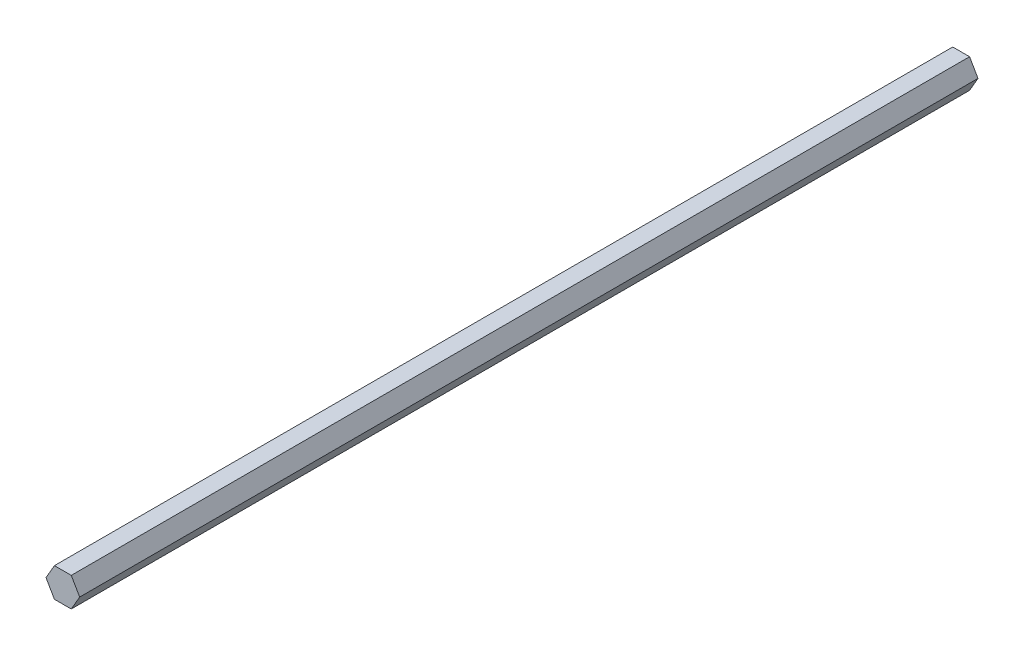
ISO-10303-21;
HEADER;
FILE_DESCRIPTION(('STEP AP214'),'2;1');
FILE_NAME('part.step','',(''),(''),'','','');
FILE_SCHEMA(('AUTOMOTIVE_DESIGN { 1 0 10303 214 1 1 1 1 }'));
ENDSEC;
DATA;
#1=APPLICATION_CONTEXT('core data for automotive mechanical design processes');
#2=APPLICATION_PROTOCOL_DEFINITION('international standard','automotive_design',2000,#1);
#3=PRODUCT_CONTEXT('',#1,'mechanical');
#4=PRODUCT('Part','Part','',(#3));
#5=PRODUCT_RELATED_PRODUCT_CATEGORY('part','',(#4));
#6=PRODUCT_DEFINITION_FORMATION('','',#4);
#7=PRODUCT_DEFINITION_CONTEXT('part definition',#1,'design');
#8=PRODUCT_DEFINITION('design','',#6,#7);
#9=PRODUCT_DEFINITION_SHAPE('','',#8);
#10=(LENGTH_UNIT() NAMED_UNIT(*) SI_UNIT(.MILLI.,.METRE.));
#11=(NAMED_UNIT(*) PLANE_ANGLE_UNIT() SI_UNIT($,.RADIAN.));
#12=(NAMED_UNIT(*) SI_UNIT($,.STERADIAN.) SOLID_ANGLE_UNIT());
#13=UNCERTAINTY_MEASURE_WITH_UNIT(LENGTH_MEASURE(1.E-05),#10,'distance_accuracy_value','');
#14=(GEOMETRIC_REPRESENTATION_CONTEXT(3) GLOBAL_UNCERTAINTY_ASSIGNED_CONTEXT((#13)) GLOBAL_UNIT_ASSIGNED_CONTEXT((#10,
#11,#12)) REPRESENTATION_CONTEXT('',''));
#15=CARTESIAN_POINT('',(0.,0.,0.));
#16=DIRECTION('',(0.,0.,1.));
#17=DIRECTION('',(1.,0.,0.));
#18=AXIS2_PLACEMENT_3D('',#15,#16,#17);
#19=CARTESIAN_POINT('',(3.66617420935418,-6.34999999999993,391.16));
#20=DIRECTION('',(-0.866025403784442,0.499999999999995,0.));
#21=DIRECTION('',(-0.499999999999995,-0.866025403784442,0.));
#22=AXIS2_PLACEMENT_3D('',#19,#20,#21);
#23=PLANE('',#22);
#24=DIRECTION('',(0.499999999999995,0.866025403784441,0.));
#25=VECTOR('',#24,1.);
#26=CARTESIAN_POINT('',(3.66617420935418,-6.34999999999993,0.));
#27=LINE('',#26,#25);
#28=CARTESIAN_POINT('',(3.66617420935418,-6.34999999999993,0.));
#29=VERTEX_POINT('',#28);
#30=CARTESIAN_POINT('',(7.33234841870822,0.,0.));
#31=VERTEX_POINT('',#30);
#32=EDGE_CURVE('E116',#29,#31,#27,.T.);
#33=ORIENTED_EDGE('',*,*,#32,.T.);
#34=DIRECTION('',(0.,0.,-1.));
#35=VECTOR('',#34,1.);
#36=CARTESIAN_POINT('',(7.33234841870822,0.,391.16));
#37=LINE('',#36,#35);
#38=CARTESIAN_POINT('',(7.33234841870822,0.,391.16));
#39=VERTEX_POINT('',#38);
#40=EDGE_CURVE('E11',#39,#31,#37,.T.);
#41=ORIENTED_EDGE('',*,*,#40,.F.);
#42=DIRECTION('',(0.499999999999995,0.866025403784441,0.));
#43=VECTOR('',#42,1.);
#44=CARTESIAN_POINT('',(3.66617420935418,-6.34999999999993,391.16));
#45=LINE('',#44,#43);
#46=CARTESIAN_POINT('',(3.66617420935418,-6.34999999999993,391.16));
#47=VERTEX_POINT('',#46);
#48=EDGE_CURVE('E126',#47,#39,#45,.T.);
#49=ORIENTED_EDGE('',*,*,#48,.F.);
#50=DIRECTION('',(0.,0.,-1.));
#51=VECTOR('',#50,1.);
#52=CARTESIAN_POINT('',(3.66617420935418,-6.34999999999993,391.16));
#53=LINE('',#52,#51);
#54=EDGE_CURVE('E112',#47,#29,#53,.T.);
#55=ORIENTED_EDGE('',*,*,#54,.T.);
#56=EDGE_LOOP('',(#33,#41,#49,#55));
#57=FACE_BOUND('',#56,.T.);
#58=ADVANCED_FACE('F32',(#57),#23,.F.);
#59=CARTESIAN_POINT('',(7.33234841870822,0.,391.16));
#60=DIRECTION('',(-0.866025403784438,-0.500000000000001,0.));
#61=DIRECTION('',(0.500000000000001,-0.866025403784438,0.));
#62=AXIS2_PLACEMENT_3D('',#59,#60,#61);
#63=PLANE('',#62);
#64=DIRECTION('',(-0.500000000000001,0.866025403784438,0.));
#65=VECTOR('',#64,1.);
#66=CARTESIAN_POINT('',(7.33234841870822,0.,0.));
#67=LINE('',#66,#65);
#68=CARTESIAN_POINT('',(3.6661742093541,6.34999999999999,0.));
#69=VERTEX_POINT('',#68);
#70=EDGE_CURVE('E119',#31,#69,#67,.T.);
#71=ORIENTED_EDGE('',*,*,#70,.T.);
#72=DIRECTION('',(0.,0.,-1.));
#73=VECTOR('',#72,1.);
#74=CARTESIAN_POINT('',(3.6661742093541,6.34999999999999,391.16));
#75=LINE('',#74,#73);
#76=CARTESIAN_POINT('',(3.6661742093541,6.34999999999999,391.16));
#77=VERTEX_POINT('',#76);
#78=EDGE_CURVE('E40',#77,#69,#75,.T.);
#79=ORIENTED_EDGE('',*,*,#78,.F.);
#80=DIRECTION('',(-0.500000000000001,0.866025403784438,0.));
#81=VECTOR('',#80,1.);
#82=CARTESIAN_POINT('',(7.33234841870822,0.,391.16));
#83=LINE('',#82,#81);
#84=EDGE_CURVE('E85',#39,#77,#83,.T.);
#85=ORIENTED_EDGE('',*,*,#84,.F.);
#86=ORIENTED_EDGE('',*,*,#40,.T.);
#87=EDGE_LOOP('',(#71,#79,#85,#86));
#88=FACE_BOUND('',#87,.T.);
#89=ADVANCED_FACE('F150',(#88),#63,.F.);
#90=CARTESIAN_POINT('',(3.6661742093541,6.34999999999999,391.16));
#91=DIRECTION('',(0.,-1.,0.));
#92=DIRECTION('',(1.,0.,0.));
#93=AXIS2_PLACEMENT_3D('',#90,#91,#92);
#94=PLANE('',#93);
#95=DIRECTION('',(-1.,0.,0.));
#96=VECTOR('',#95,1.);
#97=CARTESIAN_POINT('',(3.6661742093541,6.34999999999999,0.));
#98=LINE('',#97,#96);
#99=CARTESIAN_POINT('',(-3.66617420935414,6.34999999999996,0.));
#100=VERTEX_POINT('',#99);
#101=EDGE_CURVE('E121',#69,#100,#98,.T.);
#102=ORIENTED_EDGE('',*,*,#101,.T.);
#103=DIRECTION('',(0.,0.,-1.));
#104=VECTOR('',#103,1.);
#105=CARTESIAN_POINT('',(-3.66617420935414,6.34999999999996,391.16));
#106=LINE('',#105,#104);
#107=CARTESIAN_POINT('',(-3.66617420935414,6.34999999999996,391.16));
#108=VERTEX_POINT('',#107);
#109=EDGE_CURVE('E107',#108,#100,#106,.T.);
#110=ORIENTED_EDGE('',*,*,#109,.F.);
#111=DIRECTION('',(-1.,0.,0.));
#112=VECTOR('',#111,1.);
#113=CARTESIAN_POINT('',(3.6661742093541,6.34999999999999,391.16));
#114=LINE('',#113,#112);
#115=EDGE_CURVE('E98',#77,#108,#114,.T.);
#116=ORIENTED_EDGE('',*,*,#115,.F.);
#117=ORIENTED_EDGE('',*,*,#78,.T.);
#118=EDGE_LOOP('',(#102,#110,#116,#117));
#119=FACE_BOUND('',#118,.T.);
#120=ADVANCED_FACE('F132',(#119),#94,.F.);
#121=CARTESIAN_POINT('',(-3.66617420935414,6.34999999999996,391.16));
#122=DIRECTION('',(0.866025403784442,-0.499999999999995,0.));
#123=DIRECTION('',(0.499999999999995,0.866025403784442,0.));
#124=AXIS2_PLACEMENT_3D('',#121,#122,#123);
#125=PLANE('',#124);
#126=DIRECTION('',(-0.499999999999995,-0.866025403784441,0.));
#127=VECTOR('',#126,1.);
#128=CARTESIAN_POINT('',(-3.66617420935414,6.34999999999996,0.));
#129=LINE('',#128,#127);
#130=CARTESIAN_POINT('',(-7.33234841870822,0.,0.));
#131=VERTEX_POINT('',#130);
#132=EDGE_CURVE('E106',#100,#131,#129,.T.);
#133=ORIENTED_EDGE('',*,*,#132,.T.);
#134=DIRECTION('',(0.,0.,-1.));
#135=VECTOR('',#134,1.);
#136=CARTESIAN_POINT('',(-7.33234841870822,0.,391.16));
#137=LINE('',#136,#135);
#138=CARTESIAN_POINT('',(-7.33234841870822,0.,391.16));
#139=VERTEX_POINT('',#138);
#140=EDGE_CURVE('E103',#139,#131,#137,.T.);
#141=ORIENTED_EDGE('',*,*,#140,.F.);
#142=DIRECTION('',(-0.499999999999995,-0.866025403784441,0.));
#143=VECTOR('',#142,1.);
#144=CARTESIAN_POINT('',(-3.66617420935414,6.34999999999996,391.16));
#145=LINE('',#144,#143);
#146=EDGE_CURVE('E92',#108,#139,#145,.T.);
#147=ORIENTED_EDGE('',*,*,#146,.F.);
#148=ORIENTED_EDGE('',*,*,#109,.T.);
#149=EDGE_LOOP('',(#133,#141,#147,#148));
#150=FACE_BOUND('',#149,.T.);
#151=ADVANCED_FACE('F104',(#150),#125,.F.);
#152=CARTESIAN_POINT('',(-7.33234841870822,0.,391.16));
#153=DIRECTION('',(0.866025403784435,0.500000000000007,0.));
#154=DIRECTION('',(-0.500000000000007,0.866025403784435,0.));
#155=AXIS2_PLACEMENT_3D('',#152,#153,#154);
#156=PLANE('',#155);
#157=DIRECTION('',(0.500000000000007,-0.866025403784434,0.));
#158=VECTOR('',#157,1.);
#159=CARTESIAN_POINT('',(-7.33234841870822,0.,0.));
#160=LINE('',#159,#158);
#161=CARTESIAN_POINT('',(-3.66617420935405,-6.35000000000001,0.));
#162=VERTEX_POINT('',#161);
#163=EDGE_CURVE('E71',#131,#162,#160,.T.);
#164=ORIENTED_EDGE('',*,*,#163,.T.);
#165=DIRECTION('',(0.,0.,-1.));
#166=VECTOR('',#165,1.);
#167=CARTESIAN_POINT('',(-3.66617420935405,-6.35000000000001,391.16));
#168=LINE('',#167,#166);
#169=CARTESIAN_POINT('',(-3.66617420935405,-6.35000000000001,391.16));
#170=VERTEX_POINT('',#169);
#171=EDGE_CURVE('E108',#170,#162,#168,.T.);
#172=ORIENTED_EDGE('',*,*,#171,.F.);
#173=DIRECTION('',(0.500000000000007,-0.866025403784434,0.));
#174=VECTOR('',#173,1.);
#175=CARTESIAN_POINT('',(-7.33234841870822,0.,391.16));
#176=LINE('',#175,#174);
#177=EDGE_CURVE('E96',#139,#170,#176,.T.);
#178=ORIENTED_EDGE('',*,*,#177,.F.);
#179=ORIENTED_EDGE('',*,*,#140,.T.);
#180=EDGE_LOOP('',(#164,#172,#178,#179));
#181=FACE_BOUND('',#180,.T.);
#182=ADVANCED_FACE('F110',(#181),#156,.F.);
#183=CARTESIAN_POINT('',(-3.66617420935405,-6.35000000000001,391.16));
#184=DIRECTION('',(0.,1.,0.));
#185=DIRECTION('',(-1.,0.,0.));
#186=AXIS2_PLACEMENT_3D('',#183,#184,#185);
#187=PLANE('',#186);
#188=DIRECTION('',(1.,0.,0.));
#189=VECTOR('',#188,1.);
#190=CARTESIAN_POINT('',(-3.66617420935405,-6.35000000000001,0.));
#191=LINE('',#190,#189);
#192=EDGE_CURVE('E77',#162,#29,#191,.T.);
#193=ORIENTED_EDGE('',*,*,#192,.T.);
#194=ORIENTED_EDGE('',*,*,#54,.F.);
#195=DIRECTION('',(1.,0.,0.));
#196=VECTOR('',#195,1.);
#197=CARTESIAN_POINT('',(-3.66617420935405,-6.35000000000001,391.16));
#198=LINE('',#197,#196);
#199=EDGE_CURVE('E48',#170,#47,#198,.T.);
#200=ORIENTED_EDGE('',*,*,#199,.F.);
#201=ORIENTED_EDGE('',*,*,#171,.T.);
#202=EDGE_LOOP('',(#193,#194,#200,#201));
#203=FACE_BOUND('',#202,.T.);
#204=ADVANCED_FACE('F139',(#203),#187,.F.);
#205=CARTESIAN_POINT('',(0.,0.,391.16));
#206=DIRECTION('',(0.,0.,1.));
#207=DIRECTION('',(1.,0.,0.));
#208=AXIS2_PLACEMENT_3D('',#205,#206,#207);
#209=PLANE('',#208);
#210=ORIENTED_EDGE('',*,*,#48,.T.);
#211=ORIENTED_EDGE('',*,*,#84,.T.);
#212=ORIENTED_EDGE('',*,*,#115,.T.);
#213=ORIENTED_EDGE('',*,*,#146,.T.);
#214=ORIENTED_EDGE('',*,*,#177,.T.);
#215=ORIENTED_EDGE('',*,*,#199,.T.);
#216=EDGE_LOOP('',(#210,#211,#212,#213,#214,#215));
#217=FACE_BOUND('',#216,.T.);
#218=ADVANCED_FACE('F94',(#217),#209,.T.);
#219=CARTESIAN_POINT('',(0.,0.,0.));
#220=DIRECTION('',(0.,0.,1.));
#221=DIRECTION('',(1.,0.,0.));
#222=AXIS2_PLACEMENT_3D('',#219,#220,#221);
#223=PLANE('',#222);
#224=ORIENTED_EDGE('',*,*,#32,.F.);
#225=ORIENTED_EDGE('',*,*,#192,.F.);
#226=ORIENTED_EDGE('',*,*,#163,.F.);
#227=ORIENTED_EDGE('',*,*,#132,.F.);
#228=ORIENTED_EDGE('',*,*,#101,.F.);
#229=ORIENTED_EDGE('',*,*,#70,.F.);
#230=EDGE_LOOP('',(#224,#225,#226,#227,#228,#229));
#231=FACE_BOUND('',#230,.T.);
#232=ADVANCED_FACE('F135',(#231),#223,.F.);
#233=CLOSED_SHELL('',(#58,#89,#120,#151,#182,#204,#218,#232));
#234=MANIFOLD_SOLID_BREP('B2',#233);
#235=ADVANCED_BREP_SHAPE_REPRESENTATION('',(#18,#234),#14);
#236=SHAPE_DEFINITION_REPRESENTATION(#9,#235);
ENDSEC;
END-ISO-10303-21;
